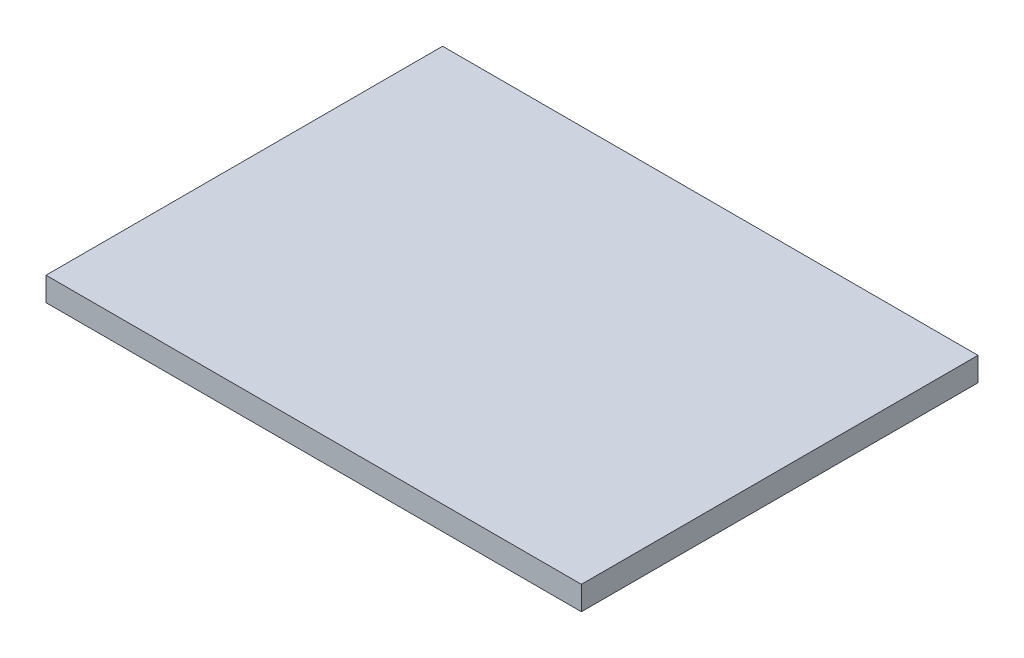
ISO-10303-21;
HEADER;
FILE_DESCRIPTION(('STEP AP214'),'2;1');
FILE_NAME('part.step','',(''),(''),'','','');
FILE_SCHEMA(('AUTOMOTIVE_DESIGN { 1 0 10303 214 1 1 1 1 }'));
ENDSEC;
DATA;
#1=APPLICATION_CONTEXT('core data for automotive mechanical design processes');
#2=APPLICATION_PROTOCOL_DEFINITION('international standard','automotive_design',2000,#1);
#3=PRODUCT_CONTEXT('',#1,'mechanical');
#4=PRODUCT('Part','Part','',(#3));
#5=PRODUCT_RELATED_PRODUCT_CATEGORY('part','',(#4));
#6=PRODUCT_DEFINITION_FORMATION('','',#4);
#7=PRODUCT_DEFINITION_CONTEXT('part definition',#1,'design');
#8=PRODUCT_DEFINITION('design','',#6,#7);
#9=PRODUCT_DEFINITION_SHAPE('','',#8);
#10=(LENGTH_UNIT() NAMED_UNIT(*) SI_UNIT(.MILLI.,.METRE.));
#11=(NAMED_UNIT(*) PLANE_ANGLE_UNIT() SI_UNIT($,.RADIAN.));
#12=(NAMED_UNIT(*) SI_UNIT($,.STERADIAN.) SOLID_ANGLE_UNIT());
#13=UNCERTAINTY_MEASURE_WITH_UNIT(LENGTH_MEASURE(1.E-05),#10,'distance_accuracy_value','');
#14=(GEOMETRIC_REPRESENTATION_CONTEXT(3) GLOBAL_UNCERTAINTY_ASSIGNED_CONTEXT((#13)) GLOBAL_UNIT_ASSIGNED_CONTEXT((#10,
#11,#12)) REPRESENTATION_CONTEXT('',''));
#15=CARTESIAN_POINT('',(0.,0.,0.));
#16=DIRECTION('',(0.,0.,1.));
#17=DIRECTION('',(1.,0.,0.));
#18=AXIS2_PLACEMENT_3D('',#15,#16,#17);
#19=CARTESIAN_POINT('',(0.,1.2,0.));
#20=DIRECTION('',(1.,0.,0.));
#21=DIRECTION('',(0.,0.,-1.));
#22=AXIS2_PLACEMENT_3D('',#19,#20,#21);
#23=PLANE('',#22);
#24=DIRECTION('',(0.,0.,1.));
#25=VECTOR('',#24,1.);
#26=CARTESIAN_POINT('',(0.,0.,0.));
#27=LINE('',#26,#25);
#28=CARTESIAN_POINT('',(0.,0.,-20.));
#29=VERTEX_POINT('',#28);
#30=CARTESIAN_POINT('',(0.,0.,0.));
#31=VERTEX_POINT('',#30);
#32=EDGE_CURVE('E107',#29,#31,#27,.T.);
#33=ORIENTED_EDGE('',*,*,#32,.T.);
#34=DIRECTION('',(0.,-1.,0.));
#35=VECTOR('',#34,1.);
#36=CARTESIAN_POINT('',(0.,1.2,0.));
#37=LINE('',#36,#35);
#38=CARTESIAN_POINT('',(0.,1.2,0.));
#39=VERTEX_POINT('',#38);
#40=EDGE_CURVE('E11',#39,#31,#37,.T.);
#41=ORIENTED_EDGE('',*,*,#40,.F.);
#42=DIRECTION('',(0.,0.,1.));
#43=VECTOR('',#42,1.);
#44=CARTESIAN_POINT('',(0.,1.2,0.));
#45=LINE('',#44,#43);
#46=CARTESIAN_POINT('',(0.,1.2,-20.));
#47=VERTEX_POINT('',#46);
#48=EDGE_CURVE('E91',#47,#39,#45,.T.);
#49=ORIENTED_EDGE('',*,*,#48,.F.);
#50=DIRECTION('',(0.,-1.,0.));
#51=VECTOR('',#50,1.);
#52=CARTESIAN_POINT('',(0.,1.2,-20.));
#53=LINE('',#52,#51);
#54=EDGE_CURVE('E103',#47,#29,#53,.T.);
#55=ORIENTED_EDGE('',*,*,#54,.T.);
#56=EDGE_LOOP('',(#33,#41,#49,#55));
#57=FACE_BOUND('',#56,.T.);
#58=ADVANCED_FACE('F39',(#57),#23,.F.);
#59=CARTESIAN_POINT('',(0.,1.2,0.));
#60=DIRECTION('',(0.,0.,-1.));
#61=DIRECTION('',(-1.,0.,0.));
#62=AXIS2_PLACEMENT_3D('',#59,#60,#61);
#63=PLANE('',#62);
#64=DIRECTION('',(1.,0.,0.));
#65=VECTOR('',#64,1.);
#66=CARTESIAN_POINT('',(0.,0.,0.));
#67=LINE('',#66,#65);
#68=CARTESIAN_POINT('',(27.,0.,0.));
#69=VERTEX_POINT('',#68);
#70=EDGE_CURVE('E96',#31,#69,#67,.T.);
#71=ORIENTED_EDGE('',*,*,#70,.T.);
#72=DIRECTION('',(0.,-1.,0.));
#73=VECTOR('',#72,1.);
#74=CARTESIAN_POINT('',(27.,1.2,0.));
#75=LINE('',#74,#73);
#76=CARTESIAN_POINT('',(27.,1.2,0.));
#77=VERTEX_POINT('',#76);
#78=EDGE_CURVE('E48',#77,#69,#75,.T.);
#79=ORIENTED_EDGE('',*,*,#78,.F.);
#80=DIRECTION('',(1.,0.,0.));
#81=VECTOR('',#80,1.);
#82=CARTESIAN_POINT('',(0.,1.2,0.));
#83=LINE('',#82,#81);
#84=EDGE_CURVE('E86',#39,#77,#83,.T.);
#85=ORIENTED_EDGE('',*,*,#84,.F.);
#86=ORIENTED_EDGE('',*,*,#40,.T.);
#87=EDGE_LOOP('',(#71,#79,#85,#86));
#88=FACE_BOUND('',#87,.T.);
#89=ADVANCED_FACE('F95',(#88),#63,.F.);
#90=CARTESIAN_POINT('',(27.,1.2,0.));
#91=DIRECTION('',(-1.,0.,0.));
#92=DIRECTION('',(0.,0.,1.));
#93=AXIS2_PLACEMENT_3D('',#90,#91,#92);
#94=PLANE('',#93);
#95=DIRECTION('',(0.,0.,-1.));
#96=VECTOR('',#95,1.);
#97=CARTESIAN_POINT('',(27.,0.,0.));
#98=LINE('',#97,#96);
#99=CARTESIAN_POINT('',(27.,0.,-20.));
#100=VERTEX_POINT('',#99);
#101=EDGE_CURVE('E73',#69,#100,#98,.T.);
#102=ORIENTED_EDGE('',*,*,#101,.T.);
#103=DIRECTION('',(0.,-1.,0.));
#104=VECTOR('',#103,1.);
#105=CARTESIAN_POINT('',(27.,1.2,-20.));
#106=LINE('',#105,#104);
#107=CARTESIAN_POINT('',(27.,1.2,-20.));
#108=VERTEX_POINT('',#107);
#109=EDGE_CURVE('E98',#108,#100,#106,.T.);
#110=ORIENTED_EDGE('',*,*,#109,.F.);
#111=DIRECTION('',(0.,0.,-1.));
#112=VECTOR('',#111,1.);
#113=CARTESIAN_POINT('',(27.,1.2,0.));
#114=LINE('',#113,#112);
#115=EDGE_CURVE('E89',#77,#108,#114,.T.);
#116=ORIENTED_EDGE('',*,*,#115,.F.);
#117=ORIENTED_EDGE('',*,*,#78,.T.);
#118=EDGE_LOOP('',(#102,#110,#116,#117));
#119=FACE_BOUND('',#118,.T.);
#120=ADVANCED_FACE('F99',(#119),#94,.F.);
#121=CARTESIAN_POINT('',(0.,1.2,-20.));
#122=DIRECTION('',(0.,0.,1.));
#123=DIRECTION('',(1.,0.,0.));
#124=AXIS2_PLACEMENT_3D('',#121,#122,#123);
#125=PLANE('',#124);
#126=DIRECTION('',(-1.,0.,0.));
#127=VECTOR('',#126,1.);
#128=CARTESIAN_POINT('',(0.,0.,-20.));
#129=LINE('',#128,#127);
#130=EDGE_CURVE('E79',#100,#29,#129,.T.);
#131=ORIENTED_EDGE('',*,*,#130,.T.);
#132=ORIENTED_EDGE('',*,*,#54,.F.);
#133=DIRECTION('',(-1.,0.,0.));
#134=VECTOR('',#133,1.);
#135=CARTESIAN_POINT('',(0.,1.2,-20.));
#136=LINE('',#135,#134);
#137=EDGE_CURVE('E56',#108,#47,#136,.T.);
#138=ORIENTED_EDGE('',*,*,#137,.F.);
#139=ORIENTED_EDGE('',*,*,#109,.T.);
#140=EDGE_LOOP('',(#131,#132,#138,#139));
#141=FACE_BOUND('',#140,.T.);
#142=ADVANCED_FACE('F120',(#141),#125,.F.);
#143=CARTESIAN_POINT('',(0.,1.2,0.));
#144=DIRECTION('',(0.,-1.,0.));
#145=DIRECTION('',(0.,0.,-1.));
#146=AXIS2_PLACEMENT_3D('',#143,#144,#145);
#147=PLANE('',#146);
#148=ORIENTED_EDGE('',*,*,#48,.T.);
#149=ORIENTED_EDGE('',*,*,#84,.T.);
#150=ORIENTED_EDGE('',*,*,#115,.T.);
#151=ORIENTED_EDGE('',*,*,#137,.T.);
#152=EDGE_LOOP('',(#148,#149,#150,#151));
#153=FACE_BOUND('',#152,.T.);
#154=ADVANCED_FACE('F87',(#153),#147,.F.);
#155=CARTESIAN_POINT('',(0.,0.,0.));
#156=DIRECTION('',(0.,-1.,0.));
#157=DIRECTION('',(0.,0.,-1.));
#158=AXIS2_PLACEMENT_3D('',#155,#156,#157);
#159=PLANE('',#158);
#160=ORIENTED_EDGE('',*,*,#32,.F.);
#161=ORIENTED_EDGE('',*,*,#130,.F.);
#162=ORIENTED_EDGE('',*,*,#101,.F.);
#163=ORIENTED_EDGE('',*,*,#70,.F.);
#164=EDGE_LOOP('',(#160,#161,#162,#163));
#165=FACE_BOUND('',#164,.T.);
#166=ADVANCED_FACE('F123',(#165),#159,.T.);
#167=CLOSED_SHELL('',(#58,#89,#120,#142,#154,#166));
#168=MANIFOLD_SOLID_BREP('B2',#167);
#169=ADVANCED_BREP_SHAPE_REPRESENTATION('',(#18,#168),#14);
#170=SHAPE_DEFINITION_REPRESENTATION(#9,#169);
ENDSEC;
END-ISO-10303-21;
